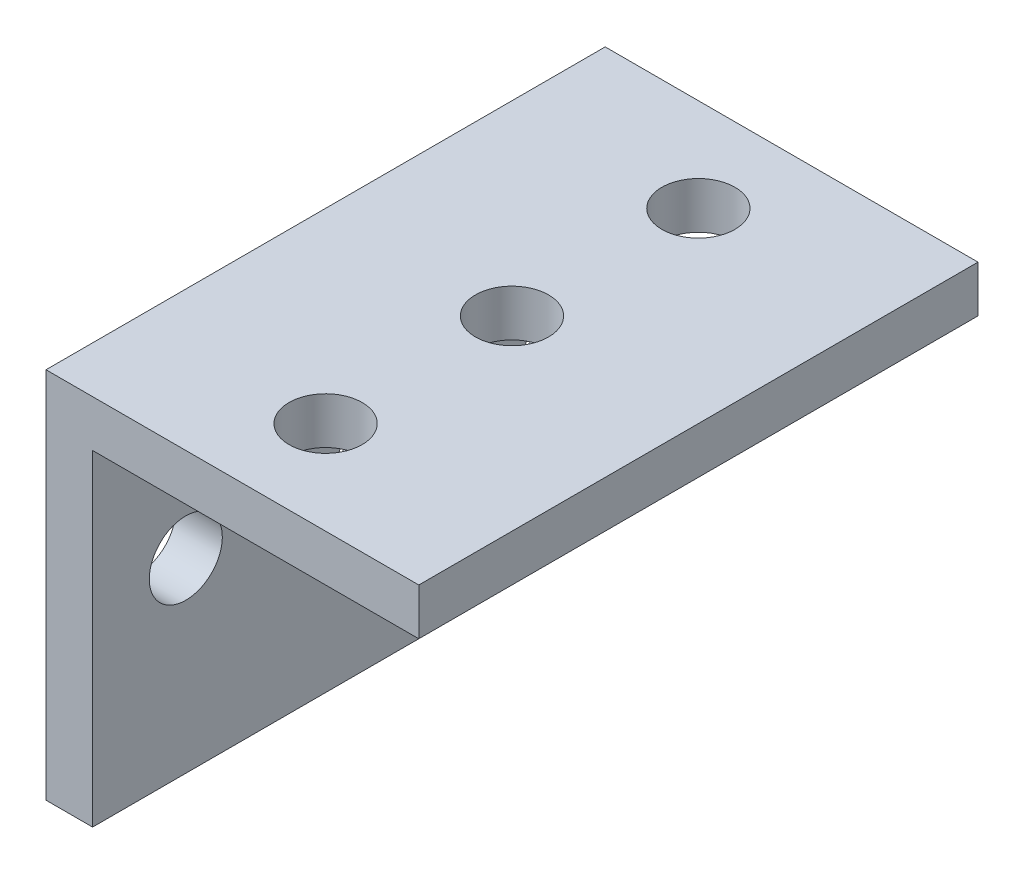
ISO-10303-21;
HEADER;
FILE_DESCRIPTION(('STEP AP214'),'2;1');
FILE_NAME('part.step','',(''),(''),'','','');
FILE_SCHEMA(('AUTOMOTIVE_DESIGN { 1 0 10303 214 1 1 1 1 }'));
ENDSEC;
DATA;
#1=APPLICATION_CONTEXT('core data for automotive mechanical design processes');
#2=APPLICATION_PROTOCOL_DEFINITION('international standard','automotive_design',2000,#1);
#3=PRODUCT_CONTEXT('',#1,'mechanical');
#4=PRODUCT('Part','Part','',(#3));
#5=PRODUCT_RELATED_PRODUCT_CATEGORY('part','',(#4));
#6=PRODUCT_DEFINITION_FORMATION('','',#4);
#7=PRODUCT_DEFINITION_CONTEXT('part definition',#1,'design');
#8=PRODUCT_DEFINITION('design','',#6,#7);
#9=PRODUCT_DEFINITION_SHAPE('','',#8);
#10=(LENGTH_UNIT() NAMED_UNIT(*) SI_UNIT(.MILLI.,.METRE.));
#11=(NAMED_UNIT(*) PLANE_ANGLE_UNIT() SI_UNIT($,.RADIAN.));
#12=(NAMED_UNIT(*) SI_UNIT($,.STERADIAN.) SOLID_ANGLE_UNIT());
#13=UNCERTAINTY_MEASURE_WITH_UNIT(LENGTH_MEASURE(1.E-05),#10,'distance_accuracy_value','');
#14=(GEOMETRIC_REPRESENTATION_CONTEXT(3) GLOBAL_UNCERTAINTY_ASSIGNED_CONTEXT((#13)) GLOBAL_UNIT_ASSIGNED_CONTEXT((#10,
#11,#12)) REPRESENTATION_CONTEXT('',''));
#15=CARTESIAN_POINT('',(0.,0.,0.));
#16=DIRECTION('',(0.,0.,1.));
#17=DIRECTION('',(1.,0.,0.));
#18=AXIS2_PLACEMENT_3D('',#15,#16,#17);
#19=CARTESIAN_POINT('',(25.4,0.,38.1));
#20=DIRECTION('',(0.,-1.,0.));
#21=DIRECTION('',(1.,0.,0.));
#22=AXIS2_PLACEMENT_3D('',#19,#20,#21);
#23=PLANE('',#22);
#24=CARTESIAN_POINT('',(12.7,0.,6.35));
#25=DIRECTION('',(0.,-1.,0.));
#26=DIRECTION('',(1.,0.,0.));
#27=AXIS2_PLACEMENT_3D('',#24,#25,#26);
#28=CIRCLE('',#27,2.4892);
#29=CARTESIAN_POINT('',(15.1892,0.,6.35));
#30=VERTEX_POINT('',#29);
#31=EDGE_CURVE('E166',#30,#30,#28,.T.);
#32=ORIENTED_EDGE('',*,*,#31,.T.);
#33=EDGE_LOOP('',(#32));
#34=FACE_BOUND('',#33,.T.);
#35=CARTESIAN_POINT('',(12.7,0.,19.05));
#36=DIRECTION('',(0.,-1.,0.));
#37=DIRECTION('',(1.,0.,0.));
#38=AXIS2_PLACEMENT_3D('',#35,#36,#37);
#39=CIRCLE('',#38,2.4892);
#40=CARTESIAN_POINT('',(15.1892,0.,19.05));
#41=VERTEX_POINT('',#40);
#42=EDGE_CURVE('E170',#41,#41,#39,.T.);
#43=ORIENTED_EDGE('',*,*,#42,.T.);
#44=EDGE_LOOP('',(#43));
#45=FACE_BOUND('',#44,.T.);
#46=CARTESIAN_POINT('',(12.7,0.,31.75));
#47=DIRECTION('',(0.,-1.,0.));
#48=DIRECTION('',(1.,0.,0.));
#49=AXIS2_PLACEMENT_3D('',#46,#47,#48);
#50=CIRCLE('',#49,2.4892);
#51=CARTESIAN_POINT('',(15.1892,0.,31.75));
#52=VERTEX_POINT('',#51);
#53=EDGE_CURVE('E173',#52,#52,#50,.T.);
#54=ORIENTED_EDGE('',*,*,#53,.T.);
#55=EDGE_LOOP('',(#54));
#56=FACE_BOUND('',#55,.T.);
#57=DIRECTION('',(-1.,0.,0.));
#58=VECTOR('',#57,1.);
#59=CARTESIAN_POINT('',(25.4,0.,0.));
#60=LINE('',#59,#58);
#61=CARTESIAN_POINT('',(25.4,0.,0.));
#62=VERTEX_POINT('',#61);
#63=CARTESIAN_POINT('',(0.,0.,0.));
#64=VERTEX_POINT('',#63);
#65=EDGE_CURVE('E121',#62,#64,#60,.T.);
#66=ORIENTED_EDGE('',*,*,#65,.T.);
#67=DIRECTION('',(0.,0.,-1.));
#68=VECTOR('',#67,1.);
#69=CARTESIAN_POINT('',(0.,0.,38.1));
#70=LINE('',#69,#68);
#71=CARTESIAN_POINT('',(0.,0.,38.1));
#72=VERTEX_POINT('',#71);
#73=EDGE_CURVE('E11',#72,#64,#70,.T.);
#74=ORIENTED_EDGE('',*,*,#73,.F.);
#75=DIRECTION('',(-1.,0.,0.));
#76=VECTOR('',#75,1.);
#77=CARTESIAN_POINT('',(25.4,0.,38.1));
#78=LINE('',#77,#76);
#79=CARTESIAN_POINT('',(25.4,0.,38.1));
#80=VERTEX_POINT('',#79);
#81=EDGE_CURVE('E132',#80,#72,#78,.T.);
#82=ORIENTED_EDGE('',*,*,#81,.F.);
#83=DIRECTION('',(0.,0.,-1.));
#84=VECTOR('',#83,1.);
#85=CARTESIAN_POINT('',(25.4,0.,38.1));
#86=LINE('',#85,#84);
#87=EDGE_CURVE('E117',#80,#62,#86,.T.);
#88=ORIENTED_EDGE('',*,*,#87,.T.);
#89=EDGE_LOOP('',(#66,#74,#82,#88));
#90=FACE_BOUND('',#89,.T.);
#91=ADVANCED_FACE('F37',(#34,#45,#56,#90),#23,.F.);
#92=CARTESIAN_POINT('',(0.,0.,38.1));
#93=DIRECTION('',(1.,0.,0.));
#94=DIRECTION('',(0.,1.,0.));
#95=AXIS2_PLACEMENT_3D('',#92,#93,#94);
#96=PLANE('',#95);
#97=CARTESIAN_POINT('',(0.,-12.7,6.35));
#98=DIRECTION('',(1.,0.,0.));
#99=DIRECTION('',(0.,1.,0.));
#100=AXIS2_PLACEMENT_3D('',#97,#98,#99);
#101=CIRCLE('',#100,2.4892);
#102=CARTESIAN_POINT('',(0.,-10.2108,6.35));
#103=VERTEX_POINT('',#102);
#104=EDGE_CURVE('E125',#103,#103,#101,.T.);
#105=ORIENTED_EDGE('',*,*,#104,.T.);
#106=EDGE_LOOP('',(#105));
#107=FACE_BOUND('',#106,.T.);
#108=CARTESIAN_POINT('',(0.,-12.7,19.05));
#109=DIRECTION('',(1.,0.,0.));
#110=DIRECTION('',(0.,1.,0.));
#111=AXIS2_PLACEMENT_3D('',#108,#109,#110);
#112=CIRCLE('',#111,2.4892);
#113=CARTESIAN_POINT('',(0.,-10.2108,19.05));
#114=VERTEX_POINT('',#113);
#115=EDGE_CURVE('E189',#114,#114,#112,.T.);
#116=ORIENTED_EDGE('',*,*,#115,.T.);
#117=EDGE_LOOP('',(#116));
#118=FACE_BOUND('',#117,.T.);
#119=CARTESIAN_POINT('',(0.,-12.7,31.75));
#120=DIRECTION('',(1.,0.,0.));
#121=DIRECTION('',(0.,1.,0.));
#122=AXIS2_PLACEMENT_3D('',#119,#120,#121);
#123=CIRCLE('',#122,2.4892);
#124=CARTESIAN_POINT('',(0.,-10.2108,31.75));
#125=VERTEX_POINT('',#124);
#126=EDGE_CURVE('E195',#125,#125,#123,.T.);
#127=ORIENTED_EDGE('',*,*,#126,.T.);
#128=EDGE_LOOP('',(#127));
#129=FACE_BOUND('',#128,.T.);
#130=DIRECTION('',(0.,-1.,0.));
#131=VECTOR('',#130,1.);
#132=CARTESIAN_POINT('',(0.,0.,0.));
#133=LINE('',#132,#131);
#134=CARTESIAN_POINT('',(0.,-25.4,0.));
#135=VERTEX_POINT('',#134);
#136=EDGE_CURVE('E124',#64,#135,#133,.T.);
#137=ORIENTED_EDGE('',*,*,#136,.T.);
#138=DIRECTION('',(0.,0.,-1.));
#139=VECTOR('',#138,1.);
#140=CARTESIAN_POINT('',(0.,-25.4,38.1));
#141=LINE('',#140,#139);
#142=CARTESIAN_POINT('',(0.,-25.4,38.1));
#143=VERTEX_POINT('',#142);
#144=EDGE_CURVE('E45',#143,#135,#141,.T.);
#145=ORIENTED_EDGE('',*,*,#144,.F.);
#146=DIRECTION('',(0.,-1.,0.));
#147=VECTOR('',#146,1.);
#148=CARTESIAN_POINT('',(0.,0.,38.1));
#149=LINE('',#148,#147);
#150=EDGE_CURVE('E90',#72,#143,#149,.T.);
#151=ORIENTED_EDGE('',*,*,#150,.F.);
#152=ORIENTED_EDGE('',*,*,#73,.T.);
#153=EDGE_LOOP('',(#137,#145,#151,#152));
#154=FACE_BOUND('',#153,.T.);
#155=ADVANCED_FACE('F157',(#107,#118,#129,#154),#96,.F.);
#156=CARTESIAN_POINT('',(0.,-25.4,38.1));
#157=DIRECTION('',(0.,1.,0.));
#158=DIRECTION('',(0.,0.,1.));
#159=AXIS2_PLACEMENT_3D('',#156,#157,#158);
#160=PLANE('',#159);
#161=DIRECTION('',(1.,0.,0.));
#162=VECTOR('',#161,1.);
#163=CARTESIAN_POINT('',(0.,-25.4,0.));
#164=LINE('',#163,#162);
#165=CARTESIAN_POINT('',(3.175,-25.4,0.));
#166=VERTEX_POINT('',#165);
#167=EDGE_CURVE('E127',#135,#166,#164,.T.);
#168=ORIENTED_EDGE('',*,*,#167,.T.);
#169=DIRECTION('',(0.,0.,-1.));
#170=VECTOR('',#169,1.);
#171=CARTESIAN_POINT('',(3.175,-25.4,38.1));
#172=LINE('',#171,#170);
#173=CARTESIAN_POINT('',(3.175,-25.4,38.1));
#174=VERTEX_POINT('',#173);
#175=EDGE_CURVE('E112',#174,#166,#172,.T.);
#176=ORIENTED_EDGE('',*,*,#175,.F.);
#177=DIRECTION('',(1.,0.,0.));
#178=VECTOR('',#177,1.);
#179=CARTESIAN_POINT('',(0.,-25.4,38.1));
#180=LINE('',#179,#178);
#181=EDGE_CURVE('E103',#143,#174,#180,.T.);
#182=ORIENTED_EDGE('',*,*,#181,.F.);
#183=ORIENTED_EDGE('',*,*,#144,.T.);
#184=EDGE_LOOP('',(#168,#176,#182,#183));
#185=FACE_BOUND('',#184,.T.);
#186=ADVANCED_FACE('F138',(#185),#160,.F.);
#187=CARTESIAN_POINT('',(3.175,-25.4,38.1));
#188=DIRECTION('',(-1.,0.,0.));
#189=DIRECTION('',(0.,-1.,0.));
#190=AXIS2_PLACEMENT_3D('',#187,#188,#189);
#191=PLANE('',#190);
#192=CARTESIAN_POINT('',(3.175,-12.7,6.35));
#193=DIRECTION('',(1.,0.,0.));
#194=DIRECTION('',(0.,1.,0.));
#195=AXIS2_PLACEMENT_3D('',#192,#193,#194);
#196=CIRCLE('',#195,2.4892);
#197=CARTESIAN_POINT('',(3.175,-10.2108,6.35));
#198=VERTEX_POINT('',#197);
#199=EDGE_CURVE('E183',#198,#198,#196,.T.);
#200=ORIENTED_EDGE('',*,*,#199,.F.);
#201=EDGE_LOOP('',(#200));
#202=FACE_BOUND('',#201,.T.);
#203=CARTESIAN_POINT('',(3.175,-12.7,19.05));
#204=DIRECTION('',(1.,0.,0.));
#205=DIRECTION('',(0.,1.,0.));
#206=AXIS2_PLACEMENT_3D('',#203,#204,#205);
#207=CIRCLE('',#206,2.4892);
#208=CARTESIAN_POINT('',(3.175,-10.2108,19.05));
#209=VERTEX_POINT('',#208);
#210=EDGE_CURVE('E186',#209,#209,#207,.T.);
#211=ORIENTED_EDGE('',*,*,#210,.F.);
#212=EDGE_LOOP('',(#211));
#213=FACE_BOUND('',#212,.T.);
#214=CARTESIAN_POINT('',(3.175,-12.7,31.75));
#215=DIRECTION('',(1.,0.,0.));
#216=DIRECTION('',(0.,1.,0.));
#217=AXIS2_PLACEMENT_3D('',#214,#215,#216);
#218=CIRCLE('',#217,2.4892);
#219=CARTESIAN_POINT('',(3.175,-10.2108,31.75));
#220=VERTEX_POINT('',#219);
#221=EDGE_CURVE('E192',#220,#220,#218,.T.);
#222=ORIENTED_EDGE('',*,*,#221,.F.);
#223=EDGE_LOOP('',(#222));
#224=FACE_BOUND('',#223,.T.);
#225=DIRECTION('',(0.,1.,0.));
#226=VECTOR('',#225,1.);
#227=CARTESIAN_POINT('',(3.175,-25.4,0.));
#228=LINE('',#227,#226);
#229=CARTESIAN_POINT('',(3.175,-3.175,0.));
#230=VERTEX_POINT('',#229);
#231=EDGE_CURVE('E111',#166,#230,#228,.T.);
#232=ORIENTED_EDGE('',*,*,#231,.T.);
#233=DIRECTION('',(0.,0.,-1.));
#234=VECTOR('',#233,1.);
#235=CARTESIAN_POINT('',(3.175,-3.175,38.1));
#236=LINE('',#235,#234);
#237=CARTESIAN_POINT('',(3.175,-3.175,38.1));
#238=VERTEX_POINT('',#237);
#239=EDGE_CURVE('E108',#238,#230,#236,.T.);
#240=ORIENTED_EDGE('',*,*,#239,.F.);
#241=DIRECTION('',(0.,1.,0.));
#242=VECTOR('',#241,1.);
#243=CARTESIAN_POINT('',(3.175,-25.4,38.1));
#244=LINE('',#243,#242);
#245=EDGE_CURVE('E97',#174,#238,#244,.T.);
#246=ORIENTED_EDGE('',*,*,#245,.F.);
#247=ORIENTED_EDGE('',*,*,#175,.T.);
#248=EDGE_LOOP('',(#232,#240,#246,#247));
#249=FACE_BOUND('',#248,.T.);
#250=ADVANCED_FACE('F109',(#202,#213,#224,#249),#191,.F.);
#251=CARTESIAN_POINT('',(3.175,-3.175,38.1));
#252=DIRECTION('',(0.,1.,0.));
#253=DIRECTION('',(-1.,0.,0.));
#254=AXIS2_PLACEMENT_3D('',#251,#252,#253);
#255=PLANE('',#254);
#256=CARTESIAN_POINT('',(12.7,-3.175,6.35));
#257=DIRECTION('',(0.,-1.,0.));
#258=DIRECTION('',(1.,0.,0.));
#259=AXIS2_PLACEMENT_3D('',#256,#257,#258);
#260=CIRCLE('',#259,2.4892);
#261=CARTESIAN_POINT('',(15.1892,-3.175,6.35));
#262=VERTEX_POINT('',#261);
#263=EDGE_CURVE('E201',#262,#262,#260,.T.);
#264=ORIENTED_EDGE('',*,*,#263,.F.);
#265=EDGE_LOOP('',(#264));
#266=FACE_BOUND('',#265,.T.);
#267=CARTESIAN_POINT('',(12.7,-3.175,19.05));
#268=DIRECTION('',(0.,-1.,0.));
#269=DIRECTION('',(1.,0.,0.));
#270=AXIS2_PLACEMENT_3D('',#267,#268,#269);
#271=CIRCLE('',#270,2.4892);
#272=CARTESIAN_POINT('',(15.1892,-3.175,19.05));
#273=VERTEX_POINT('',#272);
#274=EDGE_CURVE('E204',#273,#273,#271,.T.);
#275=ORIENTED_EDGE('',*,*,#274,.F.);
#276=EDGE_LOOP('',(#275));
#277=FACE_BOUND('',#276,.T.);
#278=CARTESIAN_POINT('',(12.7,-3.175,31.75));
#279=DIRECTION('',(0.,-1.,0.));
#280=DIRECTION('',(1.,0.,0.));
#281=AXIS2_PLACEMENT_3D('',#278,#279,#280);
#282=CIRCLE('',#281,2.4892);
#283=CARTESIAN_POINT('',(15.1892,-3.175,31.75));
#284=VERTEX_POINT('',#283);
#285=EDGE_CURVE('E175',#284,#284,#282,.T.);
#286=ORIENTED_EDGE('',*,*,#285,.F.);
#287=EDGE_LOOP('',(#286));
#288=FACE_BOUND('',#287,.T.);
#289=DIRECTION('',(1.,0.,0.));
#290=VECTOR('',#289,1.);
#291=CARTESIAN_POINT('',(3.175,-3.175,0.));
#292=LINE('',#291,#290);
#293=CARTESIAN_POINT('',(25.4,-3.175,0.));
#294=VERTEX_POINT('',#293);
#295=EDGE_CURVE('E76',#230,#294,#292,.T.);
#296=ORIENTED_EDGE('',*,*,#295,.T.);
#297=DIRECTION('',(0.,0.,-1.));
#298=VECTOR('',#297,1.);
#299=CARTESIAN_POINT('',(25.4,-3.175,38.1));
#300=LINE('',#299,#298);
#301=CARTESIAN_POINT('',(25.4,-3.175,38.1));
#302=VERTEX_POINT('',#301);
#303=EDGE_CURVE('E113',#302,#294,#300,.T.);
#304=ORIENTED_EDGE('',*,*,#303,.F.);
#305=DIRECTION('',(1.,0.,0.));
#306=VECTOR('',#305,1.);
#307=CARTESIAN_POINT('',(3.175,-3.175,38.1));
#308=LINE('',#307,#306);
#309=EDGE_CURVE('E101',#238,#302,#308,.T.);
#310=ORIENTED_EDGE('',*,*,#309,.F.);
#311=ORIENTED_EDGE('',*,*,#239,.T.);
#312=EDGE_LOOP('',(#296,#304,#310,#311));
#313=FACE_BOUND('',#312,.T.);
#314=ADVANCED_FACE('F115',(#266,#277,#288,#313),#255,.F.);
#315=CARTESIAN_POINT('',(25.4,-3.175,38.1));
#316=DIRECTION('',(-1.,0.,0.));
#317=DIRECTION('',(0.,0.,1.));
#318=AXIS2_PLACEMENT_3D('',#315,#316,#317);
#319=PLANE('',#318);
#320=DIRECTION('',(0.,1.,0.));
#321=VECTOR('',#320,1.);
#322=CARTESIAN_POINT('',(25.4,-3.175,0.));
#323=LINE('',#322,#321);
#324=EDGE_CURVE('E82',#294,#62,#323,.T.);
#325=ORIENTED_EDGE('',*,*,#324,.T.);
#326=ORIENTED_EDGE('',*,*,#87,.F.);
#327=DIRECTION('',(0.,1.,0.));
#328=VECTOR('',#327,1.);
#329=CARTESIAN_POINT('',(25.4,-3.175,38.1));
#330=LINE('',#329,#328);
#331=EDGE_CURVE('E53',#302,#80,#330,.T.);
#332=ORIENTED_EDGE('',*,*,#331,.F.);
#333=ORIENTED_EDGE('',*,*,#303,.T.);
#334=EDGE_LOOP('',(#325,#326,#332,#333));
#335=FACE_BOUND('',#334,.T.);
#336=ADVANCED_FACE('F145',(#335),#319,.F.);
#337=CARTESIAN_POINT('',(0.,0.,38.1));
#338=DIRECTION('',(0.,0.,1.));
#339=DIRECTION('',(1.,0.,0.));
#340=AXIS2_PLACEMENT_3D('',#337,#338,#339);
#341=PLANE('',#340);
#342=ORIENTED_EDGE('',*,*,#81,.T.);
#343=ORIENTED_EDGE('',*,*,#150,.T.);
#344=ORIENTED_EDGE('',*,*,#181,.T.);
#345=ORIENTED_EDGE('',*,*,#245,.T.);
#346=ORIENTED_EDGE('',*,*,#309,.T.);
#347=ORIENTED_EDGE('',*,*,#331,.T.);
#348=EDGE_LOOP('',(#342,#343,#344,#345,#346,#347));
#349=FACE_BOUND('',#348,.T.);
#350=ADVANCED_FACE('F99',(#349),#341,.T.);
#351=CARTESIAN_POINT('',(0.,0.,0.));
#352=DIRECTION('',(0.,0.,1.));
#353=DIRECTION('',(1.,0.,0.));
#354=AXIS2_PLACEMENT_3D('',#351,#352,#353);
#355=PLANE('',#354);
#356=ORIENTED_EDGE('',*,*,#65,.F.);
#357=ORIENTED_EDGE('',*,*,#324,.F.);
#358=ORIENTED_EDGE('',*,*,#295,.F.);
#359=ORIENTED_EDGE('',*,*,#231,.F.);
#360=ORIENTED_EDGE('',*,*,#167,.F.);
#361=ORIENTED_EDGE('',*,*,#136,.F.);
#362=EDGE_LOOP('',(#356,#357,#358,#359,#360,#361));
#363=FACE_BOUND('',#362,.T.);
#364=ADVANCED_FACE('F141',(#363),#355,.F.);
#365=CARTESIAN_POINT('',(0.,-12.7,31.75));
#366=DIRECTION('',(1.,0.,0.));
#367=DIRECTION('',(0.,1.,0.));
#368=AXIS2_PLACEMENT_3D('',#365,#366,#367);
#369=CYLINDRICAL_SURFACE('',#368,2.4892);
#370=ORIENTED_EDGE('',*,*,#126,.F.);
#371=EDGE_LOOP('',(#370));
#372=FACE_BOUND('',#371,.T.);
#373=ORIENTED_EDGE('',*,*,#221,.T.);
#374=EDGE_LOOP('',(#373));
#375=FACE_BOUND('',#374,.T.);
#376=ADVANCED_FACE('F233',(#372,#375),#369,.F.);
#377=CARTESIAN_POINT('',(0.,-12.7,19.05));
#378=DIRECTION('',(1.,0.,0.));
#379=DIRECTION('',(0.,1.,0.));
#380=AXIS2_PLACEMENT_3D('',#377,#378,#379);
#381=CYLINDRICAL_SURFACE('',#380,2.4892);
#382=ORIENTED_EDGE('',*,*,#115,.F.);
#383=EDGE_LOOP('',(#382));
#384=FACE_BOUND('',#383,.T.);
#385=ORIENTED_EDGE('',*,*,#210,.T.);
#386=EDGE_LOOP('',(#385));
#387=FACE_BOUND('',#386,.T.);
#388=ADVANCED_FACE('F226',(#384,#387),#381,.F.);
#389=CARTESIAN_POINT('',(0.,-12.7,6.35));
#390=DIRECTION('',(1.,0.,0.));
#391=DIRECTION('',(0.,1.,0.));
#392=AXIS2_PLACEMENT_3D('',#389,#390,#391);
#393=CYLINDRICAL_SURFACE('',#392,2.4892);
#394=ORIENTED_EDGE('',*,*,#104,.F.);
#395=EDGE_LOOP('',(#394));
#396=FACE_BOUND('',#395,.T.);
#397=ORIENTED_EDGE('',*,*,#199,.T.);
#398=EDGE_LOOP('',(#397));
#399=FACE_BOUND('',#398,.T.);
#400=ADVANCED_FACE('F217',(#396,#399),#393,.F.);
#401=CARTESIAN_POINT('',(12.7,0.,31.75));
#402=DIRECTION('',(0.,-1.,0.));
#403=DIRECTION('',(1.,0.,0.));
#404=AXIS2_PLACEMENT_3D('',#401,#402,#403);
#405=CYLINDRICAL_SURFACE('',#404,2.4892);
#406=ORIENTED_EDGE('',*,*,#53,.F.);
#407=EDGE_LOOP('',(#406));
#408=FACE_BOUND('',#407,.T.);
#409=ORIENTED_EDGE('',*,*,#285,.T.);
#410=EDGE_LOOP('',(#409));
#411=FACE_BOUND('',#410,.T.);
#412=ADVANCED_FACE('F215',(#408,#411),#405,.F.);
#413=CARTESIAN_POINT('',(12.7,0.,19.05));
#414=DIRECTION('',(0.,-1.,0.));
#415=DIRECTION('',(1.,0.,0.));
#416=AXIS2_PLACEMENT_3D('',#413,#414,#415);
#417=CYLINDRICAL_SURFACE('',#416,2.4892);
#418=ORIENTED_EDGE('',*,*,#42,.F.);
#419=EDGE_LOOP('',(#418));
#420=FACE_BOUND('',#419,.T.);
#421=ORIENTED_EDGE('',*,*,#274,.T.);
#422=EDGE_LOOP('',(#421));
#423=FACE_BOUND('',#422,.T.);
#424=ADVANCED_FACE('F210',(#420,#423),#417,.F.);
#425=CARTESIAN_POINT('',(12.7,0.,6.35));
#426=DIRECTION('',(0.,-1.,0.));
#427=DIRECTION('',(1.,0.,0.));
#428=AXIS2_PLACEMENT_3D('',#425,#426,#427);
#429=CYLINDRICAL_SURFACE('',#428,2.4892);
#430=ORIENTED_EDGE('',*,*,#31,.F.);
#431=EDGE_LOOP('',(#430));
#432=FACE_BOUND('',#431,.T.);
#433=ORIENTED_EDGE('',*,*,#263,.T.);
#434=EDGE_LOOP('',(#433));
#435=FACE_BOUND('',#434,.T.);
#436=ADVANCED_FACE('F223',(#432,#435),#429,.F.);
#437=CLOSED_SHELL('',(#91,#155,#186,#250,#314,#336,#350,#364,#376,#388,#400,#412,#424,#436));
#438=MANIFOLD_SOLID_BREP('B2',#437);
#439=ADVANCED_BREP_SHAPE_REPRESENTATION('',(#18,#438),#14);
#440=SHAPE_DEFINITION_REPRESENTATION(#9,#439);
ENDSEC;
END-ISO-10303-21;
